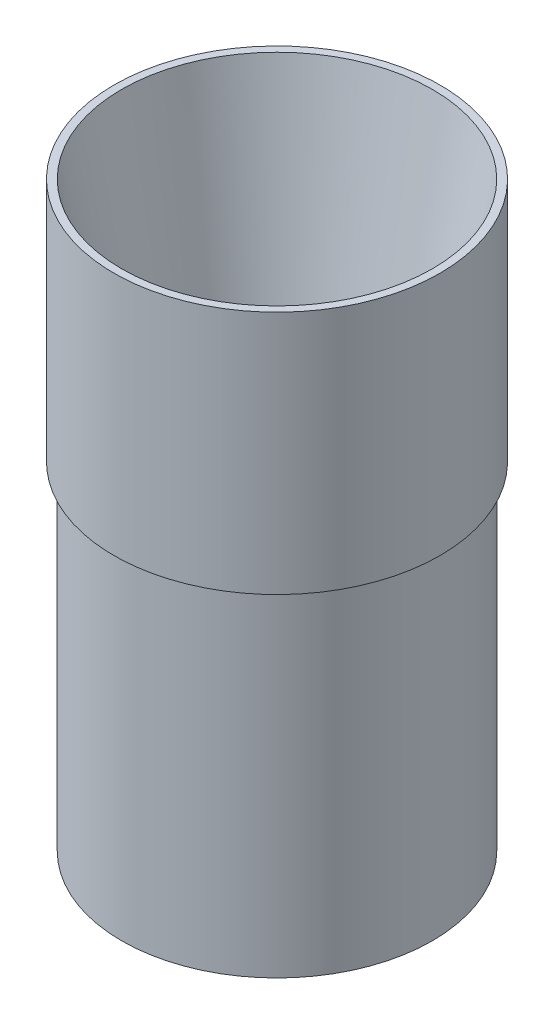
ISO-10303-21;
HEADER;
FILE_DESCRIPTION(('STEP AP214'),'2;1');
FILE_NAME('part.step','',(''),(''),'','','');
FILE_SCHEMA(('AUTOMOTIVE_DESIGN { 1 0 10303 214 1 1 1 1 }'));
ENDSEC;
DATA;
#1=APPLICATION_CONTEXT('core data for automotive mechanical design processes');
#2=APPLICATION_PROTOCOL_DEFINITION('international standard','automotive_design',2000,#1);
#3=PRODUCT_CONTEXT('',#1,'mechanical');
#4=PRODUCT('Part','Part','',(#3));
#5=PRODUCT_RELATED_PRODUCT_CATEGORY('part','',(#4));
#6=PRODUCT_DEFINITION_FORMATION('','',#4);
#7=PRODUCT_DEFINITION_CONTEXT('part definition',#1,'design');
#8=PRODUCT_DEFINITION('design','',#6,#7);
#9=PRODUCT_DEFINITION_SHAPE('','',#8);
#10=(LENGTH_UNIT() NAMED_UNIT(*) SI_UNIT(.MILLI.,.METRE.));
#11=(NAMED_UNIT(*) PLANE_ANGLE_UNIT() SI_UNIT($,.RADIAN.));
#12=(NAMED_UNIT(*) SI_UNIT($,.STERADIAN.) SOLID_ANGLE_UNIT());
#13=UNCERTAINTY_MEASURE_WITH_UNIT(LENGTH_MEASURE(1.E-05),#10,'distance_accuracy_value','');
#14=(GEOMETRIC_REPRESENTATION_CONTEXT(3) GLOBAL_UNCERTAINTY_ASSIGNED_CONTEXT((#13)) GLOBAL_UNIT_ASSIGNED_CONTEXT((#10,
#11,#12)) REPRESENTATION_CONTEXT('',''));
#15=CARTESIAN_POINT('',(0.,0.,0.));
#16=DIRECTION('',(0.,0.,1.));
#17=DIRECTION('',(1.,0.,0.));
#18=AXIS2_PLACEMENT_3D('',#15,#16,#17);
#19=CARTESIAN_POINT('',(48.41875,283.939349901387,0.));
#20=DIRECTION('',(0.,1.,0.));
#21=DIRECTION('',(-1.,0.,0.));
#22=AXIS2_PLACEMENT_3D('',#19,#20,#21);
#23=CYLINDRICAL_SURFACE('',#22,48.41875);
#24=CARTESIAN_POINT('',(48.41875,0.,0.));
#25=DIRECTION('',(0.,1.,0.));
#26=DIRECTION('',(-1.,0.,0.));
#27=AXIS2_PLACEMENT_3D('',#24,#25,#26);
#28=CIRCLE('',#27,48.41875);
#29=CARTESIAN_POINT('',(0.,0.,0.));
#30=VERTEX_POINT('',#29);
#31=EDGE_CURVE('E76',#30,#30,#28,.T.);
#32=ORIENTED_EDGE('',*,*,#31,.T.);
#33=EDGE_LOOP('',(#32));
#34=FACE_BOUND('',#33,.T.);
#35=CARTESIAN_POINT('',(48.41875,105.145818385321,0.));
#36=DIRECTION('',(0.,1.,0.));
#37=DIRECTION('',(-1.,0.,0.));
#38=AXIS2_PLACEMENT_3D('',#35,#36,#37);
#39=CIRCLE('',#38,48.41875);
#40=CARTESIAN_POINT('',(0.,105.145818385321,0.));
#41=VERTEX_POINT('',#40);
#42=EDGE_CURVE('E10',#41,#41,#39,.T.);
#43=ORIENTED_EDGE('',*,*,#42,.F.);
#44=EDGE_LOOP('',(#43));
#45=FACE_BOUND('',#44,.T.);
#46=ADVANCED_FACE('F41',(#34,#45),#23,.T.);
#47=CARTESIAN_POINT('',(-2.38124999999999,105.145818385321,0.));
#48=DIRECTION('',(0.,-1.,0.));
#49=DIRECTION('',(1.,0.,0.));
#50=AXIS2_PLACEMENT_3D('',#47,#48,#49);
#51=PLANE('',#50);
#52=ORIENTED_EDGE('',*,*,#42,.T.);
#53=EDGE_LOOP('',(#52));
#54=FACE_BOUND('',#53,.T.);
#55=CARTESIAN_POINT('',(48.41875,105.145818385321,0.));
#56=DIRECTION('',(0.,1.,0.));
#57=DIRECTION('',(-1.,0.,0.));
#58=AXIS2_PLACEMENT_3D('',#55,#56,#57);
#59=CIRCLE('',#58,50.8);
#60=CARTESIAN_POINT('',(-2.38124999999999,105.145818385321,0.));
#61=VERTEX_POINT('',#60);
#62=EDGE_CURVE('E48',#61,#61,#59,.T.);
#63=ORIENTED_EDGE('',*,*,#62,.F.);
#64=EDGE_LOOP('',(#63));
#65=FACE_BOUND('',#64,.T.);
#66=ADVANCED_FACE('F95',(#54,#65),#51,.T.);
#67=CARTESIAN_POINT('',(48.41875,283.939349901387,0.));
#68=DIRECTION('',(0.,1.,0.));
#69=DIRECTION('',(-1.,0.,0.));
#70=AXIS2_PLACEMENT_3D('',#67,#68,#69);
#71=CYLINDRICAL_SURFACE('',#70,50.8);
#72=ORIENTED_EDGE('',*,*,#62,.T.);
#73=EDGE_LOOP('',(#72));
#74=FACE_BOUND('',#73,.T.);
#75=CARTESIAN_POINT('',(48.41875,181.345818385321,0.));
#76=DIRECTION('',(0.,1.,0.));
#77=DIRECTION('',(-1.,0.,0.));
#78=AXIS2_PLACEMENT_3D('',#75,#76,#77);
#79=CIRCLE('',#78,50.8);
#80=CARTESIAN_POINT('',(-2.38125,181.345818385321,0.));
#81=VERTEX_POINT('',#80);
#82=EDGE_CURVE('E53',#81,#81,#79,.T.);
#83=ORIENTED_EDGE('',*,*,#82,.F.);
#84=EDGE_LOOP('',(#83));
#85=FACE_BOUND('',#84,.T.);
#86=ADVANCED_FACE('F99',(#74,#85),#71,.T.);
#87=CARTESIAN_POINT('',(0.,181.345818385321,0.));
#88=DIRECTION('',(0.,1.,0.));
#89=DIRECTION('',(-1.,0.,0.));
#90=AXIS2_PLACEMENT_3D('',#87,#88,#89);
#91=PLANE('',#90);
#92=ORIENTED_EDGE('',*,*,#82,.T.);
#93=EDGE_LOOP('',(#92));
#94=FACE_BOUND('',#93,.T.);
#95=CARTESIAN_POINT('',(48.41875,181.345818385321,0.));
#96=DIRECTION('',(0.,1.,0.));
#97=DIRECTION('',(-1.,0.,0.));
#98=AXIS2_PLACEMENT_3D('',#95,#96,#97);
#99=CIRCLE('',#98,48.41875);
#100=CARTESIAN_POINT('',(0.,181.345818385321,0.));
#101=VERTEX_POINT('',#100);
#102=EDGE_CURVE('E58',#101,#101,#99,.T.);
#103=ORIENTED_EDGE('',*,*,#102,.F.);
#104=EDGE_LOOP('',(#103));
#105=FACE_BOUND('',#104,.T.);
#106=ADVANCED_FACE('F103',(#94,#105),#91,.T.);
#107=CARTESIAN_POINT('',(48.41875,50.8,0.));
#108=DIRECTION('',(0.,1.,0.));
#109=DIRECTION('',(-1.,0.,0.));
#110=AXIS2_PLACEMENT_3D('',#107,#108,#109);
#111=CONICAL_SURFACE('',#110,25.4000000000001,0.174532925199437);
#112=ORIENTED_EDGE('',*,*,#102,.T.);
#113=EDGE_LOOP('',(#112));
#114=FACE_BOUND('',#113,.T.);
#115=CARTESIAN_POINT('',(48.41875,50.8,0.));
#116=DIRECTION('',(0.,1.,0.));
#117=DIRECTION('',(-1.,0.,0.));
#118=AXIS2_PLACEMENT_3D('',#115,#116,#117);
#119=CIRCLE('',#118,25.4000000000001);
#120=CARTESIAN_POINT('',(23.0187499999999,50.8,0.));
#121=VERTEX_POINT('',#120);
#122=EDGE_CURVE('E64',#121,#121,#119,.T.);
#123=ORIENTED_EDGE('',*,*,#122,.F.);
#124=EDGE_LOOP('',(#123));
#125=FACE_BOUND('',#124,.T.);
#126=ADVANCED_FACE('F109',(#114,#125),#111,.F.);
#127=CARTESIAN_POINT('',(23.0187499999999,50.8,0.));
#128=DIRECTION('',(0.,-1.,0.));
#129=DIRECTION('',(1.,0.,0.));
#130=AXIS2_PLACEMENT_3D('',#127,#128,#129);
#131=PLANE('',#130);
#132=ORIENTED_EDGE('',*,*,#122,.T.);
#133=EDGE_LOOP('',(#132));
#134=FACE_BOUND('',#133,.T.);
#135=CARTESIAN_POINT('',(48.41875,50.8,0.));
#136=DIRECTION('',(0.,1.,0.));
#137=DIRECTION('',(-1.,0.,0.));
#138=AXIS2_PLACEMENT_3D('',#135,#136,#137);
#139=CIRCLE('',#138,46.0375);
#140=CARTESIAN_POINT('',(2.38124999999999,50.8,0.));
#141=VERTEX_POINT('',#140);
#142=EDGE_CURVE('E68',#141,#141,#139,.T.);
#143=ORIENTED_EDGE('',*,*,#142,.F.);
#144=EDGE_LOOP('',(#143));
#145=FACE_BOUND('',#144,.T.);
#146=ADVANCED_FACE('F91',(#134,#145),#131,.T.);
#147=CARTESIAN_POINT('',(48.41875,283.939349901387,0.));
#148=DIRECTION('',(0.,1.,0.));
#149=DIRECTION('',(-1.,0.,0.));
#150=AXIS2_PLACEMENT_3D('',#147,#148,#149);
#151=CYLINDRICAL_SURFACE('',#150,46.0375);
#152=ORIENTED_EDGE('',*,*,#142,.T.);
#153=EDGE_LOOP('',(#152));
#154=FACE_BOUND('',#153,.T.);
#155=CARTESIAN_POINT('',(48.41875,0.,0.));
#156=DIRECTION('',(0.,1.,0.));
#157=DIRECTION('',(-1.,0.,0.));
#158=AXIS2_PLACEMENT_3D('',#155,#156,#157);
#159=CIRCLE('',#158,46.0375);
#160=CARTESIAN_POINT('',(2.38125,0.,0.));
#161=VERTEX_POINT('',#160);
#162=EDGE_CURVE('E72',#161,#161,#159,.T.);
#163=ORIENTED_EDGE('',*,*,#162,.F.);
#164=EDGE_LOOP('',(#163));
#165=FACE_BOUND('',#164,.T.);
#166=ADVANCED_FACE('F85',(#154,#165),#151,.F.);
#167=CARTESIAN_POINT('',(2.38125,0.,0.));
#168=DIRECTION('',(0.,-1.,0.));
#169=DIRECTION('',(1.,0.,0.));
#170=AXIS2_PLACEMENT_3D('',#167,#168,#169);
#171=PLANE('',#170);
#172=ORIENTED_EDGE('',*,*,#162,.T.);
#173=EDGE_LOOP('',(#172));
#174=FACE_BOUND('',#173,.T.);
#175=ORIENTED_EDGE('',*,*,#31,.F.);
#176=EDGE_LOOP('',(#175));
#177=FACE_BOUND('',#176,.T.);
#178=ADVANCED_FACE('F83',(#174,#177),#171,.T.);
#179=CLOSED_SHELL('',(#46,#66,#86,#106,#126,#146,#166,#178));
#180=MANIFOLD_SOLID_BREP('B2',#179);
#181=ADVANCED_BREP_SHAPE_REPRESENTATION('',(#18,#180),#14);
#182=SHAPE_DEFINITION_REPRESENTATION(#9,#181);
ENDSEC;
END-ISO-10303-21;
